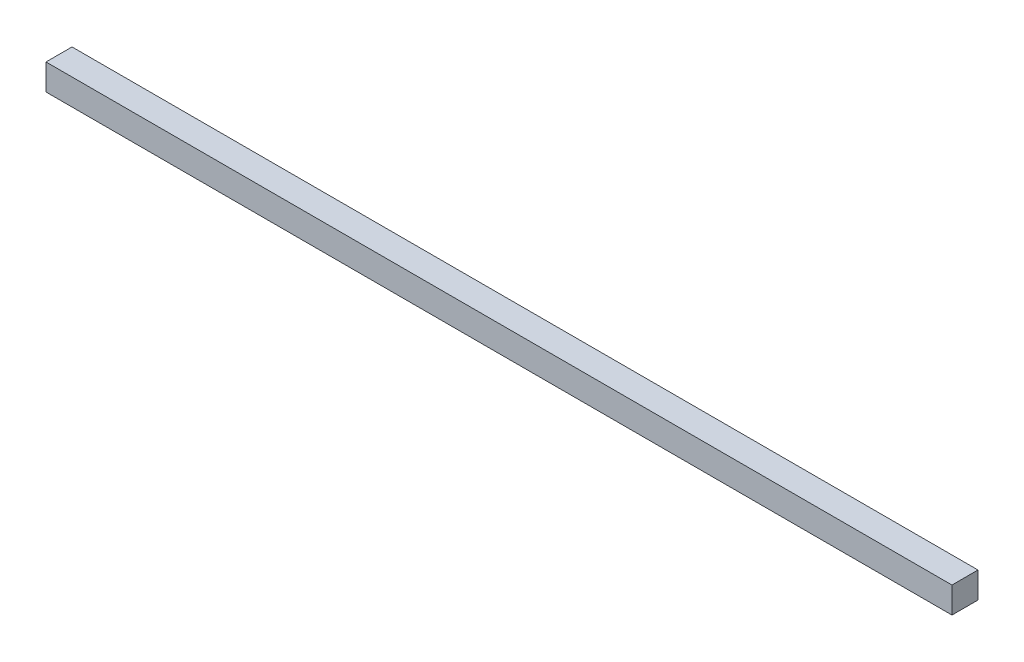
ISO-10303-21;
HEADER;
FILE_DESCRIPTION(('STEP AP214'),'2;1');
FILE_NAME('part.step','',(''),(''),'','','');
FILE_SCHEMA(('AUTOMOTIVE_DESIGN { 1 0 10303 214 1 1 1 1 }'));
ENDSEC;
DATA;
#1=APPLICATION_CONTEXT('core data for automotive mechanical design processes');
#2=APPLICATION_PROTOCOL_DEFINITION('international standard','automotive_design',2000,#1);
#3=PRODUCT_CONTEXT('',#1,'mechanical');
#4=PRODUCT('Part','Part','',(#3));
#5=PRODUCT_RELATED_PRODUCT_CATEGORY('part','',(#4));
#6=PRODUCT_DEFINITION_FORMATION('','',#4);
#7=PRODUCT_DEFINITION_CONTEXT('part definition',#1,'design');
#8=PRODUCT_DEFINITION('design','',#6,#7);
#9=PRODUCT_DEFINITION_SHAPE('','',#8);
#10=(LENGTH_UNIT() NAMED_UNIT(*) SI_UNIT(.MILLI.,.METRE.));
#11=(NAMED_UNIT(*) PLANE_ANGLE_UNIT() SI_UNIT($,.RADIAN.));
#12=(NAMED_UNIT(*) SI_UNIT($,.STERADIAN.) SOLID_ANGLE_UNIT());
#13=UNCERTAINTY_MEASURE_WITH_UNIT(LENGTH_MEASURE(1.E-05),#10,'distance_accuracy_value','');
#14=(GEOMETRIC_REPRESENTATION_CONTEXT(3) GLOBAL_UNCERTAINTY_ASSIGNED_CONTEXT((#13)) GLOBAL_UNIT_ASSIGNED_CONTEXT((#10,
#11,#12)) REPRESENTATION_CONTEXT('',''));
#15=CARTESIAN_POINT('',(0.,0.,0.));
#16=DIRECTION('',(0.,0.,1.));
#17=DIRECTION('',(1.,0.,0.));
#18=AXIS2_PLACEMENT_3D('',#15,#16,#17);
#19=CARTESIAN_POINT('',(0.,-15.875,15.875));
#20=DIRECTION('',(0.,-1.,0.));
#21=DIRECTION('',(0.,0.,-1.));
#22=AXIS2_PLACEMENT_3D('',#19,#20,#21);
#23=PLANE('',#22);
#24=DIRECTION('',(0.,0.,-1.));
#25=VECTOR('',#24,1.);
#26=CARTESIAN_POINT('',(1104.9,-15.875,0.));
#27=LINE('',#26,#25);
#28=CARTESIAN_POINT('',(1104.9,-15.875,15.875));
#29=VERTEX_POINT('',#28);
#30=CARTESIAN_POINT('',(1104.9,-15.875,-15.875));
#31=VERTEX_POINT('',#30);
#32=EDGE_CURVE('E84',#29,#31,#27,.T.);
#33=ORIENTED_EDGE('',*,*,#32,.F.);
#34=DIRECTION('',(1.,0.,0.));
#35=VECTOR('',#34,1.);
#36=CARTESIAN_POINT('',(0.,-15.875,15.875));
#37=LINE('',#36,#35);
#38=CARTESIAN_POINT('',(0.,-15.875,15.875));
#39=VERTEX_POINT('',#38);
#40=EDGE_CURVE('E71',#39,#29,#37,.T.);
#41=ORIENTED_EDGE('',*,*,#40,.F.);
#42=DIRECTION('',(0.,0.,-1.));
#43=VECTOR('',#42,1.);
#44=CARTESIAN_POINT('',(0.,-15.875,0.));
#45=LINE('',#44,#43);
#46=CARTESIAN_POINT('',(0.,-15.875,-15.875));
#47=VERTEX_POINT('',#46);
#48=EDGE_CURVE('E36',#39,#47,#45,.T.);
#49=ORIENTED_EDGE('',*,*,#48,.T.);
#50=DIRECTION('',(-1.,0.,0.));
#51=VECTOR('',#50,1.);
#52=CARTESIAN_POINT('',(0.,-15.875,-15.875));
#53=LINE('',#52,#51);
#54=EDGE_CURVE('E97',#31,#47,#53,.T.);
#55=ORIENTED_EDGE('',*,*,#54,.F.);
#56=EDGE_LOOP('',(#33,#41,#49,#55));
#57=FACE_BOUND('',#56,.T.);
#58=ADVANCED_FACE('F33',(#57),#23,.T.);
#59=CARTESIAN_POINT('',(0.,0.,0.));
#60=DIRECTION('',(1.,0.,0.));
#61=DIRECTION('',(0.,0.,-1.));
#62=AXIS2_PLACEMENT_3D('',#59,#60,#61);
#63=PLANE('',#62);
#64=DIRECTION('',(0.,0.,1.));
#65=VECTOR('',#64,1.);
#66=CARTESIAN_POINT('',(0.,15.875,-15.875));
#67=LINE('',#66,#65);
#68=CARTESIAN_POINT('',(0.,15.875,-15.875));
#69=VERTEX_POINT('',#68);
#70=CARTESIAN_POINT('',(0.,15.875,15.875));
#71=VERTEX_POINT('',#70);
#72=EDGE_CURVE('E99',#69,#71,#67,.T.);
#73=ORIENTED_EDGE('',*,*,#72,.F.);
#74=DIRECTION('',(0.,1.,0.));
#75=VECTOR('',#74,1.);
#76=CARTESIAN_POINT('',(0.,-15.875,-15.875));
#77=LINE('',#76,#75);
#78=EDGE_CURVE('E80',#47,#69,#77,.T.);
#79=ORIENTED_EDGE('',*,*,#78,.F.);
#80=ORIENTED_EDGE('',*,*,#48,.F.);
#81=DIRECTION('',(0.,1.,0.));
#82=VECTOR('',#81,1.);
#83=CARTESIAN_POINT('',(0.,15.875,15.875));
#84=LINE('',#83,#82);
#85=EDGE_CURVE('E77',#71,#39,#84,.F.);
#86=ORIENTED_EDGE('',*,*,#85,.F.);
#87=EDGE_LOOP('',(#73,#79,#80,#86));
#88=FACE_BOUND('',#87,.T.);
#89=ADVANCED_FACE('F76',(#88),#63,.F.);
#90=CARTESIAN_POINT('',(0.,15.875,15.875));
#91=DIRECTION('',(0.,0.,1.));
#92=DIRECTION('',(1.,0.,0.));
#93=AXIS2_PLACEMENT_3D('',#90,#91,#92);
#94=PLANE('',#93);
#95=DIRECTION('',(0.,1.,0.));
#96=VECTOR('',#95,1.);
#97=CARTESIAN_POINT('',(1104.9,0.,15.875));
#98=LINE('',#97,#96);
#99=CARTESIAN_POINT('',(1104.9,15.875,15.875));
#100=VERTEX_POINT('',#99);
#101=EDGE_CURVE('E86',#100,#29,#98,.F.);
#102=ORIENTED_EDGE('',*,*,#101,.F.);
#103=DIRECTION('',(1.,0.,0.));
#104=VECTOR('',#103,1.);
#105=CARTESIAN_POINT('',(0.,15.875,15.875));
#106=LINE('',#105,#104);
#107=EDGE_CURVE('E90',#71,#100,#106,.T.);
#108=ORIENTED_EDGE('',*,*,#107,.F.);
#109=ORIENTED_EDGE('',*,*,#85,.T.);
#110=ORIENTED_EDGE('',*,*,#40,.T.);
#111=EDGE_LOOP('',(#102,#108,#109,#110));
#112=FACE_BOUND('',#111,.T.);
#113=ADVANCED_FACE('F88',(#112),#94,.T.);
#114=CARTESIAN_POINT('',(1104.9,0.,0.));
#115=DIRECTION('',(1.,0.,0.));
#116=DIRECTION('',(0.,0.,-1.));
#117=AXIS2_PLACEMENT_3D('',#114,#115,#116);
#118=PLANE('',#117);
#119=DIRECTION('',(0.,1.,0.));
#120=VECTOR('',#119,1.);
#121=CARTESIAN_POINT('',(1104.9,-15.875,-15.875));
#122=LINE('',#121,#120);
#123=CARTESIAN_POINT('',(1104.9,15.875,-15.875));
#124=VERTEX_POINT('',#123);
#125=EDGE_CURVE('E51',#124,#31,#122,.F.);
#126=ORIENTED_EDGE('',*,*,#125,.F.);
#127=DIRECTION('',(0.,0.,1.));
#128=VECTOR('',#127,1.);
#129=CARTESIAN_POINT('',(1104.9,15.875,-15.875));
#130=LINE('',#129,#128);
#131=EDGE_CURVE('E42',#100,#124,#130,.F.);
#132=ORIENTED_EDGE('',*,*,#131,.F.);
#133=ORIENTED_EDGE('',*,*,#101,.T.);
#134=ORIENTED_EDGE('',*,*,#32,.T.);
#135=EDGE_LOOP('',(#126,#132,#133,#134));
#136=FACE_BOUND('',#135,.T.);
#137=ADVANCED_FACE('F105',(#136),#118,.T.);
#138=CARTESIAN_POINT('',(0.,-15.875,-15.875));
#139=DIRECTION('',(0.,0.,-1.));
#140=DIRECTION('',(-1.,0.,0.));
#141=AXIS2_PLACEMENT_3D('',#138,#139,#140);
#142=PLANE('',#141);
#143=ORIENTED_EDGE('',*,*,#125,.T.);
#144=ORIENTED_EDGE('',*,*,#54,.T.);
#145=ORIENTED_EDGE('',*,*,#78,.T.);
#146=DIRECTION('',(1.,0.,0.));
#147=VECTOR('',#146,1.);
#148=CARTESIAN_POINT('',(0.,15.875,-15.875));
#149=LINE('',#148,#147);
#150=EDGE_CURVE('E11',#124,#69,#149,.F.);
#151=ORIENTED_EDGE('',*,*,#150,.F.);
#152=EDGE_LOOP('',(#143,#144,#145,#151));
#153=FACE_BOUND('',#152,.T.);
#154=ADVANCED_FACE('F107',(#153),#142,.T.);
#155=CARTESIAN_POINT('',(0.,15.875,-15.875));
#156=DIRECTION('',(0.,1.,0.));
#157=DIRECTION('',(0.,0.,1.));
#158=AXIS2_PLACEMENT_3D('',#155,#156,#157);
#159=PLANE('',#158);
#160=ORIENTED_EDGE('',*,*,#131,.T.);
#161=ORIENTED_EDGE('',*,*,#150,.T.);
#162=ORIENTED_EDGE('',*,*,#72,.T.);
#163=ORIENTED_EDGE('',*,*,#107,.T.);
#164=EDGE_LOOP('',(#160,#161,#162,#163));
#165=FACE_BOUND('',#164,.T.);
#166=ADVANCED_FACE('F104',(#165),#159,.T.);
#167=CLOSED_SHELL('',(#58,#89,#113,#137,#154,#166));
#168=MANIFOLD_SOLID_BREP('B2',#167);
#169=ADVANCED_BREP_SHAPE_REPRESENTATION('',(#18,#168),#14);
#170=SHAPE_DEFINITION_REPRESENTATION(#9,#169);
ENDSEC;
END-ISO-10303-21;
